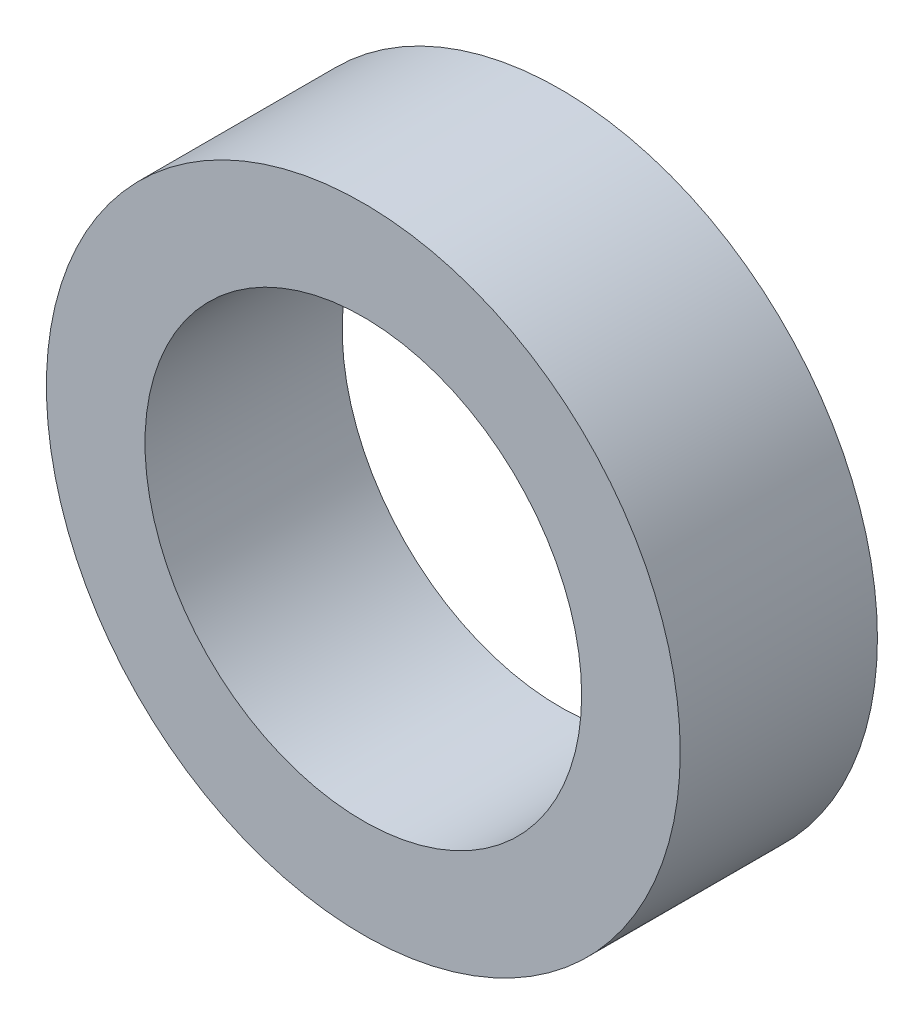
ISO-10303-21;
HEADER;
FILE_DESCRIPTION(('STEP AP214'),'2;1');
FILE_NAME('part.step','',(''),(''),'','','');
FILE_SCHEMA(('AUTOMOTIVE_DESIGN { 1 0 10303 214 1 1 1 1 }'));
ENDSEC;
DATA;
#1=APPLICATION_CONTEXT('core data for automotive mechanical design processes');
#2=APPLICATION_PROTOCOL_DEFINITION('international standard','automotive_design',2000,#1);
#3=PRODUCT_CONTEXT('',#1,'mechanical');
#4=PRODUCT('Part','Part','',(#3));
#5=PRODUCT_RELATED_PRODUCT_CATEGORY('part','',(#4));
#6=PRODUCT_DEFINITION_FORMATION('','',#4);
#7=PRODUCT_DEFINITION_CONTEXT('part definition',#1,'design');
#8=PRODUCT_DEFINITION('design','',#6,#7);
#9=PRODUCT_DEFINITION_SHAPE('','',#8);
#10=(LENGTH_UNIT() NAMED_UNIT(*) SI_UNIT(.MILLI.,.METRE.));
#11=(NAMED_UNIT(*) PLANE_ANGLE_UNIT() SI_UNIT($,.RADIAN.));
#12=(NAMED_UNIT(*) SI_UNIT($,.STERADIAN.) SOLID_ANGLE_UNIT());
#13=UNCERTAINTY_MEASURE_WITH_UNIT(LENGTH_MEASURE(1.E-05),#10,'distance_accuracy_value','');
#14=(GEOMETRIC_REPRESENTATION_CONTEXT(3) GLOBAL_UNCERTAINTY_ASSIGNED_CONTEXT((#13)) GLOBAL_UNIT_ASSIGNED_CONTEXT((#10,
#11,#12)) REPRESENTATION_CONTEXT('',''));
#15=CARTESIAN_POINT('',(0.,0.,0.));
#16=DIRECTION('',(0.,0.,1.));
#17=DIRECTION('',(1.,0.,0.));
#18=AXIS2_PLACEMENT_3D('',#15,#16,#17);
#19=CARTESIAN_POINT('',(0.,0.,2.8));
#20=DIRECTION('',(0.,0.,1.));
#21=DIRECTION('',(1.,0.,0.));
#22=AXIS2_PLACEMENT_3D('',#19,#20,#21);
#23=PLANE('',#22);
#24=CARTESIAN_POINT('',(0.,0.,2.8));
#25=DIRECTION('',(0.,0.,1.));
#26=DIRECTION('',(1.,0.,0.));
#27=AXIS2_PLACEMENT_3D('',#24,#25,#26);
#28=CIRCLE('',#27,4.5);
#29=CARTESIAN_POINT('',(4.5,0.,2.8));
#30=VERTEX_POINT('',#29);
#31=EDGE_CURVE('E10',#30,#30,#28,.T.);
#32=ORIENTED_EDGE('',*,*,#31,.T.);
#33=EDGE_LOOP('',(#32));
#34=FACE_BOUND('',#33,.T.);
#35=CARTESIAN_POINT('',(0.,0.,2.8));
#36=DIRECTION('',(0.,0.,1.));
#37=DIRECTION('',(1.,0.,0.));
#38=AXIS2_PLACEMENT_3D('',#35,#36,#37);
#39=CIRCLE('',#38,3.1);
#40=CARTESIAN_POINT('',(3.1,0.,2.8));
#41=VERTEX_POINT('',#40);
#42=EDGE_CURVE('E44',#41,#41,#39,.T.);
#43=ORIENTED_EDGE('',*,*,#42,.F.);
#44=EDGE_LOOP('',(#43));
#45=FACE_BOUND('',#44,.T.);
#46=ADVANCED_FACE('F33',(#34,#45),#23,.T.);
#47=CARTESIAN_POINT('',(0.,0.,0.));
#48=DIRECTION('',(0.,0.,1.));
#49=DIRECTION('',(1.,0.,0.));
#50=AXIS2_PLACEMENT_3D('',#47,#48,#49);
#51=PLANE('',#50);
#52=CARTESIAN_POINT('',(0.,0.,0.));
#53=DIRECTION('',(0.,0.,1.));
#54=DIRECTION('',(1.,0.,0.));
#55=AXIS2_PLACEMENT_3D('',#52,#53,#54);
#56=CIRCLE('',#55,4.5);
#57=CARTESIAN_POINT('',(4.5,0.,0.));
#58=VERTEX_POINT('',#57);
#59=EDGE_CURVE('E37',#58,#58,#56,.T.);
#60=ORIENTED_EDGE('',*,*,#59,.F.);
#61=EDGE_LOOP('',(#60));
#62=FACE_BOUND('',#61,.T.);
#63=CARTESIAN_POINT('',(0.,0.,0.));
#64=DIRECTION('',(0.,0.,1.));
#65=DIRECTION('',(1.,0.,0.));
#66=AXIS2_PLACEMENT_3D('',#63,#64,#65);
#67=CIRCLE('',#66,3.1);
#68=CARTESIAN_POINT('',(3.1,0.,0.));
#69=VERTEX_POINT('',#68);
#70=EDGE_CURVE('E46',#69,#69,#67,.T.);
#71=ORIENTED_EDGE('',*,*,#70,.T.);
#72=EDGE_LOOP('',(#71));
#73=FACE_BOUND('',#72,.T.);
#74=ADVANCED_FACE('F56',(#62,#73),#51,.F.);
#75=CARTESIAN_POINT('',(0.,0.,2.8));
#76=DIRECTION('',(0.,0.,-1.));
#77=DIRECTION('',(-1.,0.,0.));
#78=AXIS2_PLACEMENT_3D('',#75,#76,#77);
#79=CYLINDRICAL_SURFACE('',#78,4.5);
#80=ORIENTED_EDGE('',*,*,#31,.F.);
#81=EDGE_LOOP('',(#80));
#82=FACE_BOUND('',#81,.T.);
#83=ORIENTED_EDGE('',*,*,#59,.T.);
#84=EDGE_LOOP('',(#83));
#85=FACE_BOUND('',#84,.T.);
#86=ADVANCED_FACE('F35',(#82,#85),#79,.T.);
#87=CARTESIAN_POINT('',(0.,0.,2.8));
#88=DIRECTION('',(0.,0.,-1.));
#89=DIRECTION('',(-1.,0.,0.));
#90=AXIS2_PLACEMENT_3D('',#87,#88,#89);
#91=CYLINDRICAL_SURFACE('',#90,3.1);
#92=ORIENTED_EDGE('',*,*,#42,.T.);
#93=EDGE_LOOP('',(#92));
#94=FACE_BOUND('',#93,.T.);
#95=ORIENTED_EDGE('',*,*,#70,.F.);
#96=EDGE_LOOP('',(#95));
#97=FACE_BOUND('',#96,.T.);
#98=ADVANCED_FACE('F52',(#94,#97),#91,.F.);
#99=CLOSED_SHELL('',(#46,#74,#86,#98));
#100=MANIFOLD_SOLID_BREP('B2',#99);
#101=ADVANCED_BREP_SHAPE_REPRESENTATION('',(#18,#100),#14);
#102=SHAPE_DEFINITION_REPRESENTATION(#9,#101);
ENDSEC;
END-ISO-10303-21;
